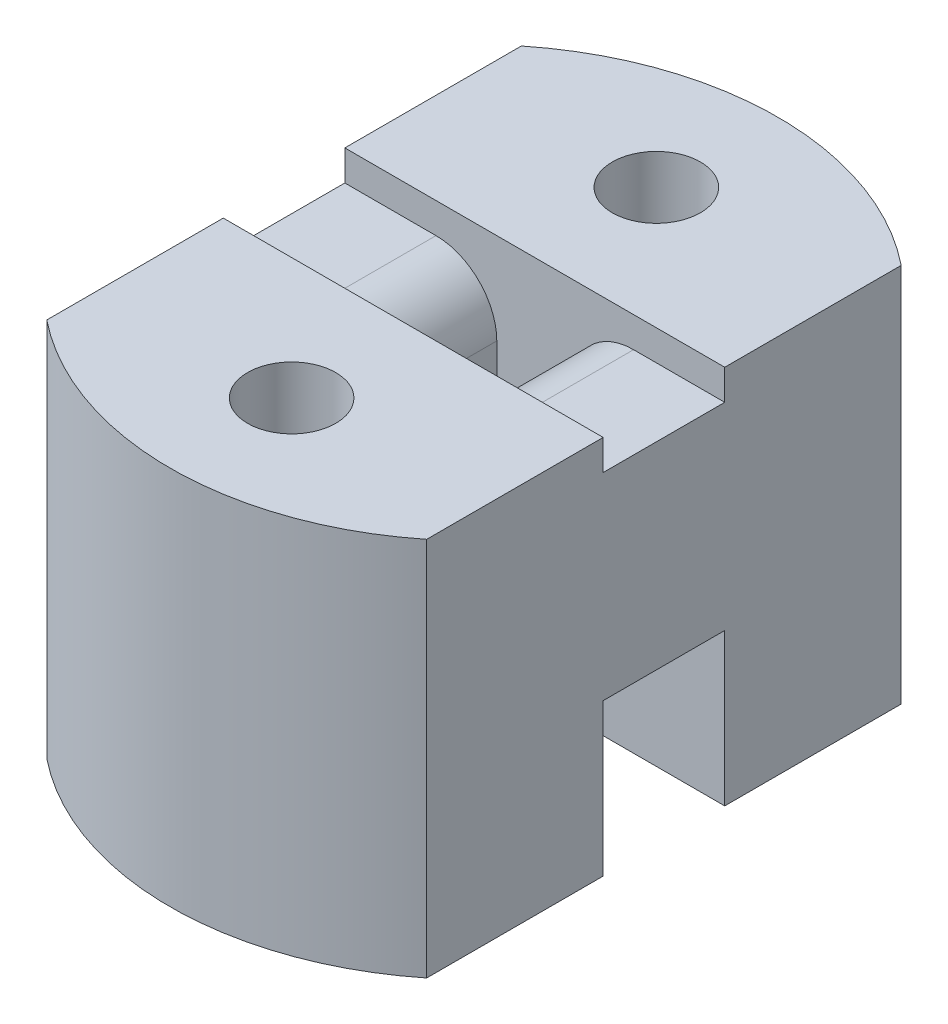
ISO-10303-21;
HEADER;
FILE_DESCRIPTION(('STEP AP214'),'2;1');
FILE_NAME('part.step','',(''),(''),'','','');
FILE_SCHEMA(('AUTOMOTIVE_DESIGN { 1 0 10303 214 1 1 1 1 }'));
ENDSEC;
DATA;
#1=APPLICATION_CONTEXT('core data for automotive mechanical design processes');
#2=APPLICATION_PROTOCOL_DEFINITION('international standard','automotive_design',2000,#1);
#3=PRODUCT_CONTEXT('',#1,'mechanical');
#4=PRODUCT('Part','Part','',(#3));
#5=PRODUCT_RELATED_PRODUCT_CATEGORY('part','',(#4));
#6=PRODUCT_DEFINITION_FORMATION('','',#4);
#7=PRODUCT_DEFINITION_CONTEXT('part definition',#1,'design');
#8=PRODUCT_DEFINITION('design','',#6,#7);
#9=PRODUCT_DEFINITION_SHAPE('','',#8);
#10=(LENGTH_UNIT() NAMED_UNIT(*) SI_UNIT(.MILLI.,.METRE.));
#11=(NAMED_UNIT(*) PLANE_ANGLE_UNIT() SI_UNIT($,.RADIAN.));
#12=(NAMED_UNIT(*) SI_UNIT($,.STERADIAN.) SOLID_ANGLE_UNIT());
#13=UNCERTAINTY_MEASURE_WITH_UNIT(LENGTH_MEASURE(1.E-05),#10,'distance_accuracy_value','');
#14=(GEOMETRIC_REPRESENTATION_CONTEXT(3) GLOBAL_UNCERTAINTY_ASSIGNED_CONTEXT((#13)) GLOBAL_UNIT_ASSIGNED_CONTEXT((#10,
#11,#12)) REPRESENTATION_CONTEXT('',''));
#15=CARTESIAN_POINT('',(0.,0.,0.));
#16=DIRECTION('',(0.,0.,1.));
#17=DIRECTION('',(1.,0.,0.));
#18=AXIS2_PLACEMENT_3D('',#15,#16,#17);
#19=CARTESIAN_POINT('',(0.,0.,0.));
#20=DIRECTION('',(0.,1.,0.));
#21=DIRECTION('',(0.,0.,1.));
#22=AXIS2_PLACEMENT_3D('',#19,#20,#21);
#23=PLANE('',#22);
#24=DIRECTION('',(-0.5,0.,0.866025403784438));
#25=VECTOR('',#24,1.);
#26=CARTESIAN_POINT('',(4.90747728811182,0.,-12.));
#27=LINE('',#26,#25);
#28=CARTESIAN_POINT('',(4.90747728811182,0.,-12.));
#29=VERTEX_POINT('',#28);
#30=CARTESIAN_POINT('',(2.45373864405591,0.,-7.75));
#31=VERTEX_POINT('',#30);
#32=EDGE_CURVE('E333',#29,#31,#27,.T.);
#33=ORIENTED_EDGE('',*,*,#32,.F.);
#34=DIRECTION('',(0.499999999999999,0.,0.866025403784439));
#35=VECTOR('',#34,1.);
#36=CARTESIAN_POINT('',(2.45373864405591,0.,-16.25));
#37=LINE('',#36,#35);
#38=CARTESIAN_POINT('',(2.45373864405591,0.,-16.25));
#39=VERTEX_POINT('',#38);
#40=EDGE_CURVE('E303',#39,#29,#37,.T.);
#41=ORIENTED_EDGE('',*,*,#40,.F.);
#42=DIRECTION('',(1.,0.,0.));
#43=VECTOR('',#42,1.);
#44=CARTESIAN_POINT('',(-2.45373864405591,0.,-16.25));
#45=LINE('',#44,#43);
#46=CARTESIAN_POINT('',(-2.45373864405591,0.,-16.25));
#47=VERTEX_POINT('',#46);
#48=EDGE_CURVE('E316',#47,#39,#45,.T.);
#49=ORIENTED_EDGE('',*,*,#48,.F.);
#50=DIRECTION('',(0.5,0.,-0.866025403784438));
#51=VECTOR('',#50,1.);
#52=CARTESIAN_POINT('',(-4.90747728811182,0.,-12.));
#53=LINE('',#52,#51);
#54=CARTESIAN_POINT('',(-4.90747728811182,0.,-12.));
#55=VERTEX_POINT('',#54);
#56=EDGE_CURVE('E342',#55,#47,#53,.T.);
#57=ORIENTED_EDGE('',*,*,#56,.F.);
#58=DIRECTION('',(-0.499999999999999,0.,-0.866025403784439));
#59=VECTOR('',#58,1.);
#60=CARTESIAN_POINT('',(-2.45373864405591,0.,-7.75));
#61=LINE('',#60,#59);
#62=CARTESIAN_POINT('',(-2.45373864405591,0.,-7.75));
#63=VERTEX_POINT('',#62);
#64=EDGE_CURVE('E339',#63,#55,#61,.T.);
#65=ORIENTED_EDGE('',*,*,#64,.F.);
#66=DIRECTION('',(-1.,0.,0.));
#67=VECTOR('',#66,1.);
#68=CARTESIAN_POINT('',(2.45373864405591,0.,-7.75));
#69=LINE('',#68,#67);
#70=EDGE_CURVE('E336',#31,#63,#69,.T.);
#71=ORIENTED_EDGE('',*,*,#70,.F.);
#72=EDGE_LOOP('',(#33,#41,#49,#57,#65,#71));
#73=FACE_BOUND('',#72,.T.);
#74=DIRECTION('',(0.,0.,1.));
#75=VECTOR('',#74,1.);
#76=CARTESIAN_POINT('',(-12.5,0.,-20.));
#77=LINE('',#76,#75);
#78=CARTESIAN_POINT('',(-12.5,0.,-15.612494995996));
#79=VERTEX_POINT('',#78);
#80=CARTESIAN_POINT('',(-12.5,0.,-4.));
#81=VERTEX_POINT('',#80);
#82=EDGE_CURVE('E543',#79,#81,#77,.T.);
#83=ORIENTED_EDGE('',*,*,#82,.F.);
#84=CARTESIAN_POINT('',(0.,0.,0.));
#85=DIRECTION('',(0.,1.,0.));
#86=DIRECTION('',(0.,0.,1.));
#87=AXIS2_PLACEMENT_3D('',#84,#85,#86);
#88=CIRCLE('',#87,20.);
#89=CARTESIAN_POINT('',(12.5,0.,-15.612494995996));
#90=VERTEX_POINT('',#89);
#91=EDGE_CURVE('E266',#90,#79,#88,.T.);
#92=ORIENTED_EDGE('',*,*,#91,.F.);
#93=DIRECTION('',(0.,0.,-1.));
#94=VECTOR('',#93,1.);
#95=CARTESIAN_POINT('',(12.5,0.,-20.));
#96=LINE('',#95,#94);
#97=CARTESIAN_POINT('',(12.5,0.,-4.));
#98=VERTEX_POINT('',#97);
#99=EDGE_CURVE('E495',#98,#90,#96,.T.);
#100=ORIENTED_EDGE('',*,*,#99,.F.);
#101=DIRECTION('',(-1.,0.,0.));
#102=VECTOR('',#101,1.);
#103=CARTESIAN_POINT('',(-2.5,0.,-4.));
#104=LINE('',#103,#102);
#105=EDGE_CURVE('E296',#98,#81,#104,.T.);
#106=ORIENTED_EDGE('',*,*,#105,.T.);
#107=EDGE_LOOP('',(#83,#92,#100,#106));
#108=FACE_BOUND('',#107,.T.);
#109=ADVANCED_FACE('F34',(#73,#108),#23,.F.);
#110=CARTESIAN_POINT('',(0.,23.,0.));
#111=DIRECTION('',(0.,1.,0.));
#112=DIRECTION('',(0.,0.,1.));
#113=AXIS2_PLACEMENT_3D('',#110,#111,#112);
#114=PLANE('',#113);
#115=DIRECTION('',(-1.,0.,0.));
#116=VECTOR('',#115,1.);
#117=CARTESIAN_POINT('',(-20.,23.,-3.99999999999999));
#118=LINE('',#117,#116);
#119=CARTESIAN_POINT('',(-6.5,23.,-4.));
#120=VERTEX_POINT('',#119);
#121=CARTESIAN_POINT('',(-12.5,23.,-4.));
#122=VERTEX_POINT('',#121);
#123=EDGE_CURVE('E418',#120,#122,#118,.T.);
#124=ORIENTED_EDGE('',*,*,#123,.T.);
#125=DIRECTION('',(0.,0.,1.));
#126=VECTOR('',#125,1.);
#127=CARTESIAN_POINT('',(-12.5,23.,0.));
#128=LINE('',#127,#126);
#129=CARTESIAN_POINT('',(-12.5,23.,4.00000000000001));
#130=VERTEX_POINT('',#129);
#131=EDGE_CURVE('E498',#122,#130,#128,.T.);
#132=ORIENTED_EDGE('',*,*,#131,.T.);
#133=DIRECTION('',(1.,0.,0.));
#134=VECTOR('',#133,1.);
#135=CARTESIAN_POINT('',(-20.,23.,4.00000000000001));
#136=LINE('',#135,#134);
#137=CARTESIAN_POINT('',(-6.5,23.,4.00000000000001));
#138=VERTEX_POINT('',#137);
#139=EDGE_CURVE('E416',#130,#138,#136,.T.);
#140=ORIENTED_EDGE('',*,*,#139,.T.);
#141=DIRECTION('',(0.,0.,1.));
#142=VECTOR('',#141,1.);
#143=CARTESIAN_POINT('',(-6.5,23.,-4.));
#144=LINE('',#143,#142);
#145=EDGE_CURVE('E447',#138,#120,#144,.F.);
#146=ORIENTED_EDGE('',*,*,#145,.T.);
#147=EDGE_LOOP('',(#124,#132,#140,#146));
#148=FACE_BOUND('',#147,.T.);
#149=ADVANCED_FACE('F503',(#148),#114,.T.);
#150=CARTESIAN_POINT('',(0.,25.,0.));
#151=DIRECTION('',(0.,1.,0.));
#152=DIRECTION('',(0.,0.,1.));
#153=AXIS2_PLACEMENT_3D('',#150,#151,#152);
#154=PLANE('',#153);
#155=CARTESIAN_POINT('',(0.,25.,-12.));
#156=DIRECTION('',(0.,1.,0.));
#157=DIRECTION('',(0.,0.,1.));
#158=AXIS2_PLACEMENT_3D('',#155,#156,#157);
#159=CIRCLE('',#158,2.9);
#160=CARTESIAN_POINT('',(0.,25.,-9.1));
#161=VERTEX_POINT('',#160);
#162=EDGE_CURVE('E409',#161,#161,#159,.T.);
#163=ORIENTED_EDGE('',*,*,#162,.F.);
#164=EDGE_LOOP('',(#163));
#165=FACE_BOUND('',#164,.T.);
#166=CARTESIAN_POINT('',(0.,25.,0.));
#167=DIRECTION('',(0.,1.,0.));
#168=DIRECTION('',(0.,0.,1.));
#169=AXIS2_PLACEMENT_3D('',#166,#167,#168);
#170=CIRCLE('',#169,20.);
#171=CARTESIAN_POINT('',(12.5,25.,-15.612494995996));
#172=VERTEX_POINT('',#171);
#173=CARTESIAN_POINT('',(-12.5,25.,-15.612494995996));
#174=VERTEX_POINT('',#173);
#175=EDGE_CURVE('E243',#172,#174,#170,.T.);
#176=ORIENTED_EDGE('',*,*,#175,.T.);
#177=DIRECTION('',(0.,0.,1.));
#178=VECTOR('',#177,1.);
#179=CARTESIAN_POINT('',(-12.5,25.,-20.));
#180=LINE('',#179,#178);
#181=CARTESIAN_POINT('',(-12.5,25.,-4.));
#182=VERTEX_POINT('',#181);
#183=EDGE_CURVE('E247',#174,#182,#180,.T.);
#184=ORIENTED_EDGE('',*,*,#183,.T.);
#185=DIRECTION('',(-1.,0.,0.));
#186=VECTOR('',#185,1.);
#187=CARTESIAN_POINT('',(0.,25.,-4.));
#188=LINE('',#187,#186);
#189=CARTESIAN_POINT('',(12.5,25.,-4.));
#190=VERTEX_POINT('',#189);
#191=EDGE_CURVE('E425',#190,#182,#188,.T.);
#192=ORIENTED_EDGE('',*,*,#191,.F.);
#193=DIRECTION('',(0.,0.,-1.));
#194=VECTOR('',#193,1.);
#195=CARTESIAN_POINT('',(12.5,25.,-20.));
#196=LINE('',#195,#194);
#197=EDGE_CURVE('E249',#190,#172,#196,.T.);
#198=ORIENTED_EDGE('',*,*,#197,.T.);
#199=EDGE_LOOP('',(#176,#184,#192,#198));
#200=FACE_BOUND('',#199,.T.);
#201=ADVANCED_FACE('F245',(#165,#200),#154,.T.);
#202=CARTESIAN_POINT('',(0.,25.,0.));
#203=DIRECTION('',(0.,-1.,0.));
#204=DIRECTION('',(0.,0.,-1.));
#205=AXIS2_PLACEMENT_3D('',#202,#203,#204);
#206=CYLINDRICAL_SURFACE('',#205,20.);
#207=ORIENTED_EDGE('',*,*,#91,.T.);
#208=DIRECTION('',(0.,-1.,0.));
#209=VECTOR('',#208,1.);
#210=CARTESIAN_POINT('',(-12.5,25.,-15.612494995996));
#211=LINE('',#210,#209);
#212=EDGE_CURVE('E258',#174,#79,#211,.T.);
#213=ORIENTED_EDGE('',*,*,#212,.F.);
#214=ORIENTED_EDGE('',*,*,#175,.F.);
#215=DIRECTION('',(0.,-1.,0.));
#216=VECTOR('',#215,1.);
#217=CARTESIAN_POINT('',(12.5,25.,-15.612494995996));
#218=LINE('',#217,#216);
#219=EDGE_CURVE('E280',#90,#172,#218,.F.);
#220=ORIENTED_EDGE('',*,*,#219,.F.);
#221=EDGE_LOOP('',(#207,#213,#214,#220));
#222=FACE_BOUND('',#221,.T.);
#223=ADVANCED_FACE('F264',(#222),#206,.T.);
#224=DIRECTION('',(0.,-1.,0.));
#225=VECTOR('',#224,1.);
#226=CARTESIAN_POINT('',(12.5,25.,15.612494995996));
#227=LINE('',#226,#225);
#228=CARTESIAN_POINT('',(12.5,25.,15.612494995996));
#229=VERTEX_POINT('',#228);
#230=CARTESIAN_POINT('',(12.5,0.,15.612494995996));
#231=VERTEX_POINT('',#230);
#232=EDGE_CURVE('E282',#229,#231,#227,.T.);
#233=ORIENTED_EDGE('',*,*,#232,.F.);
#234=CARTESIAN_POINT('',(-12.5,25.,15.612494995996));
#235=VERTEX_POINT('',#234);
#236=EDGE_CURVE('E254',#235,#229,#170,.T.);
#237=ORIENTED_EDGE('',*,*,#236,.F.);
#238=DIRECTION('',(0.,-1.,0.));
#239=VECTOR('',#238,1.);
#240=CARTESIAN_POINT('',(-12.5,25.,15.612494995996));
#241=LINE('',#240,#239);
#242=CARTESIAN_POINT('',(-12.5,0.,15.612494995996));
#243=VERTEX_POINT('',#242);
#244=EDGE_CURVE('E267',#243,#235,#241,.F.);
#245=ORIENTED_EDGE('',*,*,#244,.F.);
#246=EDGE_CURVE('E420',#243,#231,#88,.T.);
#247=ORIENTED_EDGE('',*,*,#246,.T.);
#248=EDGE_LOOP('',(#233,#237,#245,#247));
#249=FACE_BOUND('',#248,.T.);
#250=ADVANCED_FACE('F554',(#249),#206,.T.);
#251=CARTESIAN_POINT('',(0.,25.,12.));
#252=DIRECTION('',(0.,1.,0.));
#253=DIRECTION('',(0.,0.,1.));
#254=AXIS2_PLACEMENT_3D('',#251,#252,#253);
#255=CIRCLE('',#254,2.9);
#256=CARTESIAN_POINT('',(0.,25.,14.9));
#257=VERTEX_POINT('',#256);
#258=EDGE_CURVE('E412',#257,#257,#255,.T.);
#259=ORIENTED_EDGE('',*,*,#258,.F.);
#260=EDGE_LOOP('',(#259));
#261=FACE_BOUND('',#260,.T.);
#262=DIRECTION('',(1.,0.,0.));
#263=VECTOR('',#262,1.);
#264=CARTESIAN_POINT('',(0.,25.,4.00000000000001));
#265=LINE('',#264,#263);
#266=CARTESIAN_POINT('',(-12.5,25.,4.));
#267=VERTEX_POINT('',#266);
#268=CARTESIAN_POINT('',(12.5,25.,4.));
#269=VERTEX_POINT('',#268);
#270=EDGE_CURVE('E253',#267,#269,#265,.T.);
#271=ORIENTED_EDGE('',*,*,#270,.F.);
#272=EDGE_CURVE('E262',#267,#235,#180,.T.);
#273=ORIENTED_EDGE('',*,*,#272,.T.);
#274=ORIENTED_EDGE('',*,*,#236,.T.);
#275=EDGE_CURVE('E544',#229,#269,#196,.T.);
#276=ORIENTED_EDGE('',*,*,#275,.T.);
#277=EDGE_LOOP('',(#271,#273,#274,#276));
#278=FACE_BOUND('',#277,.T.);
#279=ADVANCED_FACE('F550',(#261,#278),#154,.T.);
#280=DIRECTION('',(-0.5,0.,0.866025403784439));
#281=VECTOR('',#280,1.);
#282=CARTESIAN_POINT('',(4.90747728811182,0.,12.));
#283=LINE('',#282,#281);
#284=CARTESIAN_POINT('',(4.90747728811182,0.,12.));
#285=VERTEX_POINT('',#284);
#286=CARTESIAN_POINT('',(2.45373864405591,0.,16.25));
#287=VERTEX_POINT('',#286);
#288=EDGE_CURVE('E382',#285,#287,#283,.T.);
#289=ORIENTED_EDGE('',*,*,#288,.F.);
#290=DIRECTION('',(0.499999999999999,0.,0.866025403784439));
#291=VECTOR('',#290,1.);
#292=CARTESIAN_POINT('',(2.45373864405591,0.,7.75));
#293=LINE('',#292,#291);
#294=CARTESIAN_POINT('',(2.45373864405591,0.,7.75));
#295=VERTEX_POINT('',#294);
#296=EDGE_CURVE('E380',#295,#285,#293,.T.);
#297=ORIENTED_EDGE('',*,*,#296,.F.);
#298=DIRECTION('',(1.,0.,0.));
#299=VECTOR('',#298,1.);
#300=CARTESIAN_POINT('',(-2.4537386440559,0.,7.75));
#301=LINE('',#300,#299);
#302=CARTESIAN_POINT('',(-2.4537386440559,0.,7.75));
#303=VERTEX_POINT('',#302);
#304=EDGE_CURVE('E364',#303,#295,#301,.T.);
#305=ORIENTED_EDGE('',*,*,#304,.F.);
#306=DIRECTION('',(0.5,0.,-0.866025403784438));
#307=VECTOR('',#306,1.);
#308=CARTESIAN_POINT('',(-4.90747728811182,0.,12.));
#309=LINE('',#308,#307);
#310=CARTESIAN_POINT('',(-4.90747728811182,0.,12.));
#311=VERTEX_POINT('',#310);
#312=EDGE_CURVE('E391',#311,#303,#309,.T.);
#313=ORIENTED_EDGE('',*,*,#312,.F.);
#314=DIRECTION('',(-0.5,0.,-0.866025403784439));
#315=VECTOR('',#314,1.);
#316=CARTESIAN_POINT('',(-2.45373864405591,0.,16.25));
#317=LINE('',#316,#315);
#318=CARTESIAN_POINT('',(-2.45373864405591,0.,16.25));
#319=VERTEX_POINT('',#318);
#320=EDGE_CURVE('E388',#319,#311,#317,.T.);
#321=ORIENTED_EDGE('',*,*,#320,.F.);
#322=DIRECTION('',(-1.,0.,0.));
#323=VECTOR('',#322,1.);
#324=CARTESIAN_POINT('',(2.45373864405591,0.,16.25));
#325=LINE('',#324,#323);
#326=EDGE_CURVE('E385',#287,#319,#325,.T.);
#327=ORIENTED_EDGE('',*,*,#326,.F.);
#328=EDGE_LOOP('',(#289,#297,#305,#313,#321,#327));
#329=FACE_BOUND('',#328,.T.);
#330=CARTESIAN_POINT('',(-12.5,0.,4.));
#331=VERTEX_POINT('',#330);
#332=EDGE_CURVE('E541',#331,#243,#77,.T.);
#333=ORIENTED_EDGE('',*,*,#332,.F.);
#334=DIRECTION('',(1.,0.,0.));
#335=VECTOR('',#334,1.);
#336=CARTESIAN_POINT('',(-2.5,0.,4.00000000000001));
#337=LINE('',#336,#335);
#338=CARTESIAN_POINT('',(12.5,0.,4.));
#339=VERTEX_POINT('',#338);
#340=EDGE_CURVE('E293',#331,#339,#337,.T.);
#341=ORIENTED_EDGE('',*,*,#340,.T.);
#342=EDGE_CURVE('E491',#231,#339,#96,.T.);
#343=ORIENTED_EDGE('',*,*,#342,.F.);
#344=ORIENTED_EDGE('',*,*,#246,.F.);
#345=EDGE_LOOP('',(#333,#341,#343,#344));
#346=FACE_BOUND('',#345,.T.);
#347=ADVANCED_FACE('F539',(#329,#346),#23,.F.);
#348=CARTESIAN_POINT('',(6.5,23.,4.00000000000001));
#349=VERTEX_POINT('',#348);
#350=CARTESIAN_POINT('',(12.5,23.,4.00000000000001));
#351=VERTEX_POINT('',#350);
#352=EDGE_CURVE('E415',#349,#351,#136,.T.);
#353=ORIENTED_EDGE('',*,*,#352,.T.);
#354=DIRECTION('',(0.,0.,-1.));
#355=VECTOR('',#354,1.);
#356=CARTESIAN_POINT('',(12.5,23.,0.));
#357=LINE('',#356,#355);
#358=CARTESIAN_POINT('',(12.5,23.,-4.00000000000001));
#359=VERTEX_POINT('',#358);
#360=EDGE_CURVE('E277',#351,#359,#357,.T.);
#361=ORIENTED_EDGE('',*,*,#360,.T.);
#362=CARTESIAN_POINT('',(6.5,23.,-4.));
#363=VERTEX_POINT('',#362);
#364=EDGE_CURVE('E419',#359,#363,#118,.T.);
#365=ORIENTED_EDGE('',*,*,#364,.T.);
#366=DIRECTION('',(0.,0.,-1.));
#367=VECTOR('',#366,1.);
#368=CARTESIAN_POINT('',(6.5,23.,4.00000000000001));
#369=LINE('',#368,#367);
#370=EDGE_CURVE('E449',#363,#349,#369,.F.);
#371=ORIENTED_EDGE('',*,*,#370,.T.);
#372=EDGE_LOOP('',(#353,#361,#365,#371));
#373=FACE_BOUND('',#372,.T.);
#374=ADVANCED_FACE('F517',(#373),#114,.T.);
#375=CARTESIAN_POINT('',(-20.,23.,-3.99999999999999));
#376=DIRECTION('',(0.,0.,-1.));
#377=DIRECTION('',(-1.,0.,0.));
#378=AXIS2_PLACEMENT_3D('',#375,#376,#377);
#379=PLANE('',#378);
#380=DIRECTION('',(0.,1.,0.));
#381=VECTOR('',#380,1.);
#382=CARTESIAN_POINT('',(-12.5,23.,-4.));
#383=LINE('',#382,#381);
#384=CARTESIAN_POINT('',(-12.5,10.,-4.));
#385=VERTEX_POINT('',#384);
#386=EDGE_CURVE('E56',#81,#385,#383,.T.);
#387=ORIENTED_EDGE('',*,*,#386,.F.);
#388=ORIENTED_EDGE('',*,*,#105,.F.);
#389=DIRECTION('',(0.,-1.,0.));
#390=VECTOR('',#389,1.);
#391=CARTESIAN_POINT('',(12.5,23.,-4.));
#392=LINE('',#391,#390);
#393=CARTESIAN_POINT('',(12.5,10.,-4.00000000000001));
#394=VERTEX_POINT('',#393);
#395=EDGE_CURVE('E269',#394,#98,#392,.T.);
#396=ORIENTED_EDGE('',*,*,#395,.F.);
#397=DIRECTION('',(1.,0.,0.));
#398=VECTOR('',#397,1.);
#399=CARTESIAN_POINT('',(-20.,10.,-3.99999999999999));
#400=LINE('',#399,#398);
#401=CARTESIAN_POINT('',(6.5,10.,-4.));
#402=VERTEX_POINT('',#401);
#403=EDGE_CURVE('E285',#402,#394,#400,.T.);
#404=ORIENTED_EDGE('',*,*,#403,.F.);
#405=CARTESIAN_POINT('',(6.5,14.,-4.));
#406=DIRECTION('',(0.,0.,-1.));
#407=DIRECTION('',(-1.,0.,0.));
#408=AXIS2_PLACEMENT_3D('',#405,#406,#407);
#409=CIRCLE('',#408,4.);
#410=CARTESIAN_POINT('',(2.5,14.,-4.));
#411=VERTEX_POINT('',#410);
#412=EDGE_CURVE('E456',#402,#411,#409,.T.);
#413=ORIENTED_EDGE('',*,*,#412,.T.);
#414=DIRECTION('',(0.,1.,0.));
#415=VECTOR('',#414,1.);
#416=CARTESIAN_POINT('',(2.5,0.,-4.));
#417=LINE('',#416,#415);
#418=CARTESIAN_POINT('',(2.5,19.,-4.));
#419=VERTEX_POINT('',#418);
#420=EDGE_CURVE('E304',#411,#419,#417,.T.);
#421=ORIENTED_EDGE('',*,*,#420,.T.);
#422=CARTESIAN_POINT('',(6.5,19.,-4.));
#423=DIRECTION('',(0.,0.,-1.));
#424=DIRECTION('',(-1.,0.,0.));
#425=AXIS2_PLACEMENT_3D('',#422,#423,#424);
#426=CIRCLE('',#425,4.);
#427=EDGE_CURVE('E466',#419,#363,#426,.T.);
#428=ORIENTED_EDGE('',*,*,#427,.T.);
#429=ORIENTED_EDGE('',*,*,#364,.F.);
#430=EDGE_CURVE('E276',#190,#359,#392,.T.);
#431=ORIENTED_EDGE('',*,*,#430,.F.);
#432=ORIENTED_EDGE('',*,*,#191,.T.);
#433=EDGE_CURVE('E261',#122,#182,#383,.T.);
#434=ORIENTED_EDGE('',*,*,#433,.F.);
#435=ORIENTED_EDGE('',*,*,#123,.F.);
#436=CARTESIAN_POINT('',(-6.5,19.,-4.));
#437=DIRECTION('',(0.,0.,-1.));
#438=DIRECTION('',(-1.,0.,0.));
#439=AXIS2_PLACEMENT_3D('',#436,#437,#438);
#440=CIRCLE('',#439,4.);
#441=CARTESIAN_POINT('',(-2.5,19.,-4.));
#442=VERTEX_POINT('',#441);
#443=EDGE_CURVE('E464',#120,#442,#440,.T.);
#444=ORIENTED_EDGE('',*,*,#443,.T.);
#445=DIRECTION('',(0.,1.,0.));
#446=VECTOR('',#445,1.);
#447=CARTESIAN_POINT('',(-2.5,0.,-4.));
#448=LINE('',#447,#446);
#449=CARTESIAN_POINT('',(-2.5,14.,-4.));
#450=VERTEX_POINT('',#449);
#451=EDGE_CURVE('E300',#450,#442,#448,.T.);
#452=ORIENTED_EDGE('',*,*,#451,.F.);
#453=CARTESIAN_POINT('',(-6.5,14.,-4.));
#454=DIRECTION('',(0.,0.,-1.));
#455=DIRECTION('',(-1.,0.,0.));
#456=AXIS2_PLACEMENT_3D('',#453,#454,#455);
#457=CIRCLE('',#456,4.);
#458=CARTESIAN_POINT('',(-6.5,10.,-4.));
#459=VERTEX_POINT('',#458);
#460=EDGE_CURVE('E453',#450,#459,#457,.T.);
#461=ORIENTED_EDGE('',*,*,#460,.T.);
#462=EDGE_CURVE('E288',#385,#459,#400,.T.);
#463=ORIENTED_EDGE('',*,*,#462,.F.);
#464=EDGE_LOOP('',(#387,#388,#396,#404,#413,#421,#428,#429,#431,#432,#434,#435,#444,#452,#461,#463));
#465=FACE_BOUND('',#464,.T.);
#466=ADVANCED_FACE('F476',(#465),#379,.F.);
#467=CARTESIAN_POINT('',(-20.,23.,4.00000000000001));
#468=DIRECTION('',(0.,0.,1.));
#469=DIRECTION('',(1.,0.,0.));
#470=AXIS2_PLACEMENT_3D('',#467,#468,#469);
#471=PLANE('',#470);
#472=DIRECTION('',(0.,-1.,0.));
#473=VECTOR('',#472,1.);
#474=CARTESIAN_POINT('',(-12.5,23.,4.00000000000001));
#475=LINE('',#474,#473);
#476=EDGE_CURVE('E493',#267,#130,#475,.T.);
#477=ORIENTED_EDGE('',*,*,#476,.F.);
#478=ORIENTED_EDGE('',*,*,#270,.T.);
#479=DIRECTION('',(0.,1.,0.));
#480=VECTOR('',#479,1.);
#481=CARTESIAN_POINT('',(12.5,23.,4.00000000000001));
#482=LINE('',#481,#480);
#483=EDGE_CURVE('E271',#351,#269,#482,.T.);
#484=ORIENTED_EDGE('',*,*,#483,.F.);
#485=ORIENTED_EDGE('',*,*,#352,.F.);
#486=CARTESIAN_POINT('',(6.5,19.,4.00000000000001));
#487=DIRECTION('',(0.,0.,1.));
#488=DIRECTION('',(1.,0.,0.));
#489=AXIS2_PLACEMENT_3D('',#486,#487,#488);
#490=CIRCLE('',#489,4.);
#491=CARTESIAN_POINT('',(2.5,19.,4.00000000000001));
#492=VERTEX_POINT('',#491);
#493=EDGE_CURVE('E469',#349,#492,#490,.T.);
#494=ORIENTED_EDGE('',*,*,#493,.T.);
#495=DIRECTION('',(0.,1.,0.));
#496=VECTOR('',#495,1.);
#497=CARTESIAN_POINT('',(2.5,0.,4.00000000000001));
#498=LINE('',#497,#496);
#499=CARTESIAN_POINT('',(2.5,14.,4.00000000000001));
#500=VERTEX_POINT('',#499);
#501=EDGE_CURVE('E307',#500,#492,#498,.T.);
#502=ORIENTED_EDGE('',*,*,#501,.F.);
#503=CARTESIAN_POINT('',(6.5,14.,4.00000000000001));
#504=DIRECTION('',(0.,0.,1.));
#505=DIRECTION('',(1.,0.,0.));
#506=AXIS2_PLACEMENT_3D('',#503,#504,#505);
#507=CIRCLE('',#506,4.);
#508=CARTESIAN_POINT('',(6.5,10.,4.00000000000001));
#509=VERTEX_POINT('',#508);
#510=EDGE_CURVE('E458',#500,#509,#507,.T.);
#511=ORIENTED_EDGE('',*,*,#510,.T.);
#512=DIRECTION('',(-1.,0.,0.));
#513=VECTOR('',#512,1.);
#514=CARTESIAN_POINT('',(-20.,10.,4.00000000000001));
#515=LINE('',#514,#513);
#516=CARTESIAN_POINT('',(12.5,10.,4.00000000000001));
#517=VERTEX_POINT('',#516);
#518=EDGE_CURVE('E292',#517,#509,#515,.T.);
#519=ORIENTED_EDGE('',*,*,#518,.F.);
#520=EDGE_CURVE('E49',#339,#517,#482,.T.);
#521=ORIENTED_EDGE('',*,*,#520,.F.);
#522=ORIENTED_EDGE('',*,*,#340,.F.);
#523=CARTESIAN_POINT('',(-12.5,10.,4.00000000000001));
#524=VERTEX_POINT('',#523);
#525=EDGE_CURVE('E489',#524,#331,#475,.T.);
#526=ORIENTED_EDGE('',*,*,#525,.F.);
#527=CARTESIAN_POINT('',(-6.5,10.,4.00000000000001));
#528=VERTEX_POINT('',#527);
#529=EDGE_CURVE('E289',#528,#524,#515,.T.);
#530=ORIENTED_EDGE('',*,*,#529,.F.);
#531=CARTESIAN_POINT('',(-6.5,14.,4.00000000000001));
#532=DIRECTION('',(0.,0.,1.));
#533=DIRECTION('',(1.,0.,0.));
#534=AXIS2_PLACEMENT_3D('',#531,#532,#533);
#535=CIRCLE('',#534,4.);
#536=CARTESIAN_POINT('',(-2.5,14.,4.00000000000001));
#537=VERTEX_POINT('',#536);
#538=EDGE_CURVE('E451',#528,#537,#535,.T.);
#539=ORIENTED_EDGE('',*,*,#538,.T.);
#540=DIRECTION('',(0.,1.,0.));
#541=VECTOR('',#540,1.);
#542=CARTESIAN_POINT('',(-2.5,0.,4.00000000000001));
#543=LINE('',#542,#541);
#544=CARTESIAN_POINT('',(-2.5,19.,4.00000000000001));
#545=VERTEX_POINT('',#544);
#546=EDGE_CURVE('E299',#537,#545,#543,.T.);
#547=ORIENTED_EDGE('',*,*,#546,.T.);
#548=CARTESIAN_POINT('',(-6.5,19.,4.00000000000001));
#549=DIRECTION('',(0.,0.,1.));
#550=DIRECTION('',(1.,0.,0.));
#551=AXIS2_PLACEMENT_3D('',#548,#549,#550);
#552=CIRCLE('',#551,4.);
#553=EDGE_CURVE('E461',#545,#138,#552,.T.);
#554=ORIENTED_EDGE('',*,*,#553,.T.);
#555=ORIENTED_EDGE('',*,*,#139,.F.);
#556=EDGE_LOOP('',(#477,#478,#484,#485,#494,#502,#511,#519,#521,#522,#526,#530,#539,#547,#554,#555));
#557=FACE_BOUND('',#556,.T.);
#558=ADVANCED_FACE('F486',(#557),#471,.F.);
#559=CARTESIAN_POINT('',(0.,10.,0.));
#560=DIRECTION('',(0.,-1.,0.));
#561=DIRECTION('',(0.,0.,-1.));
#562=AXIS2_PLACEMENT_3D('',#559,#560,#561);
#563=PLANE('',#562);
#564=ORIENTED_EDGE('',*,*,#403,.T.);
#565=DIRECTION('',(0.,0.,1.));
#566=VECTOR('',#565,1.);
#567=CARTESIAN_POINT('',(12.5,10.,0.));
#568=LINE('',#567,#566);
#569=EDGE_CURVE('E12',#394,#517,#568,.T.);
#570=ORIENTED_EDGE('',*,*,#569,.T.);
#571=ORIENTED_EDGE('',*,*,#518,.T.);
#572=DIRECTION('',(0.,0.,-1.));
#573=VECTOR('',#572,1.);
#574=CARTESIAN_POINT('',(6.5,10.,-4.));
#575=LINE('',#574,#573);
#576=EDGE_CURVE('E439',#509,#402,#575,.T.);
#577=ORIENTED_EDGE('',*,*,#576,.T.);
#578=EDGE_LOOP('',(#564,#570,#571,#577));
#579=FACE_BOUND('',#578,.T.);
#580=ADVANCED_FACE('F535',(#579),#563,.T.);
#581=ORIENTED_EDGE('',*,*,#529,.T.);
#582=DIRECTION('',(0.,0.,-1.));
#583=VECTOR('',#582,1.);
#584=CARTESIAN_POINT('',(-12.5,10.,0.));
#585=LINE('',#584,#583);
#586=EDGE_CURVE('E42',#524,#385,#585,.T.);
#587=ORIENTED_EDGE('',*,*,#586,.T.);
#588=ORIENTED_EDGE('',*,*,#462,.T.);
#589=DIRECTION('',(0.,0.,1.));
#590=VECTOR('',#589,1.);
#591=CARTESIAN_POINT('',(-6.5,10.,4.00000000000001));
#592=LINE('',#591,#590);
#593=EDGE_CURVE('E427',#459,#528,#592,.T.);
#594=ORIENTED_EDGE('',*,*,#593,.T.);
#595=EDGE_LOOP('',(#581,#587,#588,#594));
#596=FACE_BOUND('',#595,.T.);
#597=ADVANCED_FACE('F472',(#596),#563,.T.);
#598=CARTESIAN_POINT('',(-2.5,0.,-4.));
#599=DIRECTION('',(-1.,0.,0.));
#600=DIRECTION('',(0.,0.,1.));
#601=AXIS2_PLACEMENT_3D('',#598,#599,#600);
#602=PLANE('',#601);
#603=ORIENTED_EDGE('',*,*,#546,.F.);
#604=DIRECTION('',(0.,0.,1.));
#605=VECTOR('',#604,1.);
#606=CARTESIAN_POINT('',(-2.5,14.,-4.));
#607=LINE('',#606,#605);
#608=EDGE_CURVE('E437',#537,#450,#607,.F.);
#609=ORIENTED_EDGE('',*,*,#608,.T.);
#610=ORIENTED_EDGE('',*,*,#451,.T.);
#611=DIRECTION('',(0.,0.,1.));
#612=VECTOR('',#611,1.);
#613=CARTESIAN_POINT('',(-2.5,19.,4.00000000000001));
#614=LINE('',#613,#612);
#615=EDGE_CURVE('E434',#442,#545,#614,.T.);
#616=ORIENTED_EDGE('',*,*,#615,.T.);
#617=EDGE_LOOP('',(#603,#609,#610,#616));
#618=FACE_BOUND('',#617,.T.);
#619=ADVANCED_FACE('F648',(#618),#602,.F.);
#620=CARTESIAN_POINT('',(2.5,0.,-4.));
#621=DIRECTION('',(1.,0.,0.));
#622=DIRECTION('',(0.,0.,-1.));
#623=AXIS2_PLACEMENT_3D('',#620,#621,#622);
#624=PLANE('',#623);
#625=ORIENTED_EDGE('',*,*,#420,.F.);
#626=DIRECTION('',(0.,0.,-1.));
#627=VECTOR('',#626,1.);
#628=CARTESIAN_POINT('',(2.5,14.,4.00000000000001));
#629=LINE('',#628,#627);
#630=EDGE_CURVE('E445',#411,#500,#629,.F.);
#631=ORIENTED_EDGE('',*,*,#630,.T.);
#632=ORIENTED_EDGE('',*,*,#501,.T.);
#633=DIRECTION('',(0.,0.,-1.));
#634=VECTOR('',#633,1.);
#635=CARTESIAN_POINT('',(2.5,19.,-4.));
#636=LINE('',#635,#634);
#637=EDGE_CURVE('E442',#492,#419,#636,.T.);
#638=ORIENTED_EDGE('',*,*,#637,.T.);
#639=EDGE_LOOP('',(#625,#631,#632,#638));
#640=FACE_BOUND('',#639,.T.);
#641=ADVANCED_FACE('F526',(#640),#624,.F.);
#642=CARTESIAN_POINT('',(0.,25.,-12.));
#643=DIRECTION('',(0.,1.,0.));
#644=DIRECTION('',(0.,0.,1.));
#645=AXIS2_PLACEMENT_3D('',#642,#643,#644);
#646=CYLINDRICAL_SURFACE('',#645,2.9);
#647=ORIENTED_EDGE('',*,*,#162,.T.);
#648=EDGE_LOOP('',(#647));
#649=FACE_BOUND('',#648,.T.);
#650=CARTESIAN_POINT('',(0.,6.,-12.));
#651=DIRECTION('',(0.,-1.,0.));
#652=DIRECTION('',(0.,0.,-1.));
#653=AXIS2_PLACEMENT_3D('',#650,#651,#652);
#654=CIRCLE('',#653,2.9);
#655=CARTESIAN_POINT('',(0.,6.,-14.9));
#656=VERTEX_POINT('',#655);
#657=EDGE_CURVE('E349',#656,#656,#654,.F.);
#658=ORIENTED_EDGE('',*,*,#657,.F.);
#659=EDGE_LOOP('',(#658));
#660=FACE_BOUND('',#659,.T.);
#661=ADVANCED_FACE('F612',(#649,#660),#646,.F.);
#662=CARTESIAN_POINT('',(0.,25.,12.));
#663=DIRECTION('',(0.,1.,0.));
#664=DIRECTION('',(0.,0.,1.));
#665=AXIS2_PLACEMENT_3D('',#662,#663,#664);
#666=CYLINDRICAL_SURFACE('',#665,2.9);
#667=ORIENTED_EDGE('',*,*,#258,.T.);
#668=EDGE_LOOP('',(#667));
#669=FACE_BOUND('',#668,.T.);
#670=CARTESIAN_POINT('',(0.,6.,12.));
#671=DIRECTION('',(0.,-1.,0.));
#672=DIRECTION('',(0.,0.,-1.));
#673=AXIS2_PLACEMENT_3D('',#670,#671,#672);
#674=CIRCLE('',#673,2.9);
#675=CARTESIAN_POINT('',(0.,6.,9.1));
#676=VERTEX_POINT('',#675);
#677=EDGE_CURVE('E398',#676,#676,#674,.F.);
#678=ORIENTED_EDGE('',*,*,#677,.F.);
#679=EDGE_LOOP('',(#678));
#680=FACE_BOUND('',#679,.T.);
#681=ADVANCED_FACE('F607',(#669,#680),#666,.F.);
#682=CARTESIAN_POINT('',(0.,6.,0.));
#683=DIRECTION('',(0.,-1.,0.));
#684=DIRECTION('',(0.,0.,-1.));
#685=AXIS2_PLACEMENT_3D('',#682,#683,#684);
#686=PLANE('',#685);
#687=DIRECTION('',(0.499999999999999,0.,0.866025403784439));
#688=VECTOR('',#687,1.);
#689=CARTESIAN_POINT('',(2.45373864405591,6.,7.75));
#690=LINE('',#689,#688);
#691=CARTESIAN_POINT('',(2.45373864405591,6.,7.75));
#692=VERTEX_POINT('',#691);
#693=CARTESIAN_POINT('',(4.90747728811182,6.,12.));
#694=VERTEX_POINT('',#693);
#695=EDGE_CURVE('E360',#692,#694,#690,.T.);
#696=ORIENTED_EDGE('',*,*,#695,.T.);
#697=DIRECTION('',(-0.5,0.,0.866025403784439));
#698=VECTOR('',#697,1.);
#699=CARTESIAN_POINT('',(4.90747728811182,6.,12.));
#700=LINE('',#699,#698);
#701=CARTESIAN_POINT('',(2.45373864405591,6.,16.25));
#702=VERTEX_POINT('',#701);
#703=EDGE_CURVE('E363',#694,#702,#700,.T.);
#704=ORIENTED_EDGE('',*,*,#703,.T.);
#705=DIRECTION('',(-1.,0.,0.));
#706=VECTOR('',#705,1.);
#707=CARTESIAN_POINT('',(2.45373864405591,6.,16.25));
#708=LINE('',#707,#706);
#709=CARTESIAN_POINT('',(-2.45373864405591,6.,16.25));
#710=VERTEX_POINT('',#709);
#711=EDGE_CURVE('E367',#702,#710,#708,.T.);
#712=ORIENTED_EDGE('',*,*,#711,.T.);
#713=DIRECTION('',(-0.5,0.,-0.866025403784439));
#714=VECTOR('',#713,1.);
#715=CARTESIAN_POINT('',(-2.45373864405591,6.,16.25));
#716=LINE('',#715,#714);
#717=CARTESIAN_POINT('',(-4.90747728811182,6.,12.));
#718=VERTEX_POINT('',#717);
#719=EDGE_CURVE('E370',#710,#718,#716,.T.);
#720=ORIENTED_EDGE('',*,*,#719,.T.);
#721=DIRECTION('',(0.5,0.,-0.866025403784438));
#722=VECTOR('',#721,1.);
#723=CARTESIAN_POINT('',(-4.90747728811182,6.,12.));
#724=LINE('',#723,#722);
#725=CARTESIAN_POINT('',(-2.4537386440559,6.,7.75));
#726=VERTEX_POINT('',#725);
#727=EDGE_CURVE('E373',#718,#726,#724,.T.);
#728=ORIENTED_EDGE('',*,*,#727,.T.);
#729=DIRECTION('',(1.,0.,0.));
#730=VECTOR('',#729,1.);
#731=CARTESIAN_POINT('',(-2.4537386440559,6.,7.75));
#732=LINE('',#731,#730);
#733=EDGE_CURVE('E376',#726,#692,#732,.T.);
#734=ORIENTED_EDGE('',*,*,#733,.T.);
#735=EDGE_LOOP('',(#696,#704,#712,#720,#728,#734));
#736=FACE_BOUND('',#735,.T.);
#737=ORIENTED_EDGE('',*,*,#677,.T.);
#738=EDGE_LOOP('',(#737));
#739=FACE_BOUND('',#738,.T.);
#740=ADVANCED_FACE('F604',(#736,#739),#686,.T.);
#741=CARTESIAN_POINT('',(2.45373864405591,6.,7.75));
#742=DIRECTION('',(0.866025403784439,0.,-0.499999999999999));
#743=DIRECTION('',(-0.499999999999999,0.,-0.866025403784439));
#744=AXIS2_PLACEMENT_3D('',#741,#742,#743);
#745=PLANE('',#744);
#746=ORIENTED_EDGE('',*,*,#296,.T.);
#747=DIRECTION('',(0.,-1.,0.));
#748=VECTOR('',#747,1.);
#749=CARTESIAN_POINT('',(4.90747728811182,6.,12.));
#750=LINE('',#749,#748);
#751=EDGE_CURVE('E379',#694,#285,#750,.T.);
#752=ORIENTED_EDGE('',*,*,#751,.F.);
#753=ORIENTED_EDGE('',*,*,#695,.F.);
#754=DIRECTION('',(0.,-1.,0.));
#755=VECTOR('',#754,1.);
#756=CARTESIAN_POINT('',(2.45373864405591,6.,7.75));
#757=LINE('',#756,#755);
#758=EDGE_CURVE('E396',#692,#295,#757,.T.);
#759=ORIENTED_EDGE('',*,*,#758,.T.);
#760=EDGE_LOOP('',(#746,#752,#753,#759));
#761=FACE_BOUND('',#760,.T.);
#762=ADVANCED_FACE('F590',(#761),#745,.F.);
#763=CARTESIAN_POINT('',(-2.4537386440559,6.,7.75));
#764=DIRECTION('',(0.,0.,-1.));
#765=DIRECTION('',(-1.,0.,0.));
#766=AXIS2_PLACEMENT_3D('',#763,#764,#765);
#767=PLANE('',#766);
#768=ORIENTED_EDGE('',*,*,#304,.T.);
#769=ORIENTED_EDGE('',*,*,#758,.F.);
#770=ORIENTED_EDGE('',*,*,#733,.F.);
#771=DIRECTION('',(0.,-1.,0.));
#772=VECTOR('',#771,1.);
#773=CARTESIAN_POINT('',(-2.4537386440559,6.,7.75));
#774=LINE('',#773,#772);
#775=EDGE_CURVE('E399',#726,#303,#774,.T.);
#776=ORIENTED_EDGE('',*,*,#775,.T.);
#777=EDGE_LOOP('',(#768,#769,#770,#776));
#778=FACE_BOUND('',#777,.T.);
#779=ADVANCED_FACE('F593',(#778),#767,.F.);
#780=CARTESIAN_POINT('',(-4.90747728811182,6.,12.));
#781=DIRECTION('',(-0.866025403784438,0.,-0.5));
#782=DIRECTION('',(-0.5,0.,0.866025403784438));
#783=AXIS2_PLACEMENT_3D('',#780,#781,#782);
#784=PLANE('',#783);
#785=ORIENTED_EDGE('',*,*,#312,.T.);
#786=ORIENTED_EDGE('',*,*,#775,.F.);
#787=ORIENTED_EDGE('',*,*,#727,.F.);
#788=DIRECTION('',(0.,-1.,0.));
#789=VECTOR('',#788,1.);
#790=CARTESIAN_POINT('',(-4.90747728811182,6.,12.));
#791=LINE('',#790,#789);
#792=EDGE_CURVE('E401',#718,#311,#791,.T.);
#793=ORIENTED_EDGE('',*,*,#792,.T.);
#794=EDGE_LOOP('',(#785,#786,#787,#793));
#795=FACE_BOUND('',#794,.T.);
#796=ADVANCED_FACE('F596',(#795),#784,.F.);
#797=CARTESIAN_POINT('',(-2.45373864405591,6.,16.25));
#798=DIRECTION('',(-0.866025403784439,0.,0.5));
#799=DIRECTION('',(0.5,0.,0.866025403784439));
#800=AXIS2_PLACEMENT_3D('',#797,#798,#799);
#801=PLANE('',#800);
#802=ORIENTED_EDGE('',*,*,#320,.T.);
#803=ORIENTED_EDGE('',*,*,#792,.F.);
#804=ORIENTED_EDGE('',*,*,#719,.F.);
#805=DIRECTION('',(0.,-1.,0.));
#806=VECTOR('',#805,1.);
#807=CARTESIAN_POINT('',(-2.45373864405591,6.,16.25));
#808=LINE('',#807,#806);
#809=EDGE_CURVE('E403',#710,#319,#808,.T.);
#810=ORIENTED_EDGE('',*,*,#809,.T.);
#811=EDGE_LOOP('',(#802,#803,#804,#810));
#812=FACE_BOUND('',#811,.T.);
#813=ADVANCED_FACE('F600',(#812),#801,.F.);
#814=CARTESIAN_POINT('',(2.45373864405591,6.,16.25));
#815=DIRECTION('',(0.,0.,1.));
#816=DIRECTION('',(1.,0.,0.));
#817=AXIS2_PLACEMENT_3D('',#814,#815,#816);
#818=PLANE('',#817);
#819=ORIENTED_EDGE('',*,*,#326,.T.);
#820=ORIENTED_EDGE('',*,*,#809,.F.);
#821=ORIENTED_EDGE('',*,*,#711,.F.);
#822=DIRECTION('',(0.,-1.,0.));
#823=VECTOR('',#822,1.);
#824=CARTESIAN_POINT('',(2.45373864405591,6.,16.25));
#825=LINE('',#824,#823);
#826=EDGE_CURVE('E405',#702,#287,#825,.T.);
#827=ORIENTED_EDGE('',*,*,#826,.T.);
#828=EDGE_LOOP('',(#819,#820,#821,#827));
#829=FACE_BOUND('',#828,.T.);
#830=ADVANCED_FACE('F602',(#829),#818,.F.);
#831=CARTESIAN_POINT('',(4.90747728811182,6.,12.));
#832=DIRECTION('',(0.866025403784439,0.,0.5));
#833=DIRECTION('',(0.5,0.,-0.866025403784439));
#834=AXIS2_PLACEMENT_3D('',#831,#832,#833);
#835=PLANE('',#834);
#836=ORIENTED_EDGE('',*,*,#288,.T.);
#837=ORIENTED_EDGE('',*,*,#826,.F.);
#838=ORIENTED_EDGE('',*,*,#703,.F.);
#839=ORIENTED_EDGE('',*,*,#751,.T.);
#840=EDGE_LOOP('',(#836,#837,#838,#839));
#841=FACE_BOUND('',#840,.T.);
#842=ADVANCED_FACE('F585',(#841),#835,.F.);
#843=CARTESIAN_POINT('',(0.,6.,0.));
#844=DIRECTION('',(0.,-1.,0.));
#845=DIRECTION('',(0.,0.,-1.));
#846=AXIS2_PLACEMENT_3D('',#843,#844,#845);
#847=PLANE('',#846);
#848=DIRECTION('',(0.499999999999999,0.,0.866025403784439));
#849=VECTOR('',#848,1.);
#850=CARTESIAN_POINT('',(2.45373864405591,6.,-16.25));
#851=LINE('',#850,#849);
#852=CARTESIAN_POINT('',(2.45373864405591,6.,-16.25));
#853=VERTEX_POINT('',#852);
#854=CARTESIAN_POINT('',(4.90747728811182,6.,-12.));
#855=VERTEX_POINT('',#854);
#856=EDGE_CURVE('E312',#853,#855,#851,.T.);
#857=ORIENTED_EDGE('',*,*,#856,.T.);
#858=DIRECTION('',(-0.5,0.,0.866025403784438));
#859=VECTOR('',#858,1.);
#860=CARTESIAN_POINT('',(4.90747728811182,6.,-12.));
#861=LINE('',#860,#859);
#862=CARTESIAN_POINT('',(2.45373864405591,6.,-7.75));
#863=VERTEX_POINT('',#862);
#864=EDGE_CURVE('E315',#855,#863,#861,.T.);
#865=ORIENTED_EDGE('',*,*,#864,.T.);
#866=DIRECTION('',(-1.,0.,0.));
#867=VECTOR('',#866,1.);
#868=CARTESIAN_POINT('',(2.45373864405591,6.,-7.75));
#869=LINE('',#868,#867);
#870=CARTESIAN_POINT('',(-2.45373864405591,6.,-7.75));
#871=VERTEX_POINT('',#870);
#872=EDGE_CURVE('E319',#863,#871,#869,.T.);
#873=ORIENTED_EDGE('',*,*,#872,.T.);
#874=DIRECTION('',(-0.499999999999999,0.,-0.866025403784439));
#875=VECTOR('',#874,1.);
#876=CARTESIAN_POINT('',(-2.45373864405591,6.,-7.75));
#877=LINE('',#876,#875);
#878=CARTESIAN_POINT('',(-4.90747728811182,6.,-12.));
#879=VERTEX_POINT('',#878);
#880=EDGE_CURVE('E322',#871,#879,#877,.T.);
#881=ORIENTED_EDGE('',*,*,#880,.T.);
#882=DIRECTION('',(0.5,0.,-0.866025403784438));
#883=VECTOR('',#882,1.);
#884=CARTESIAN_POINT('',(-4.90747728811182,6.,-12.));
#885=LINE('',#884,#883);
#886=CARTESIAN_POINT('',(-2.45373864405591,6.,-16.25));
#887=VERTEX_POINT('',#886);
#888=EDGE_CURVE('E325',#879,#887,#885,.T.);
#889=ORIENTED_EDGE('',*,*,#888,.T.);
#890=DIRECTION('',(1.,0.,0.));
#891=VECTOR('',#890,1.);
#892=CARTESIAN_POINT('',(-2.45373864405591,6.,-16.25));
#893=LINE('',#892,#891);
#894=EDGE_CURVE('E328',#887,#853,#893,.T.);
#895=ORIENTED_EDGE('',*,*,#894,.T.);
#896=EDGE_LOOP('',(#857,#865,#873,#881,#889,#895));
#897=FACE_BOUND('',#896,.T.);
#898=ORIENTED_EDGE('',*,*,#657,.T.);
#899=EDGE_LOOP('',(#898));
#900=FACE_BOUND('',#899,.T.);
#901=ADVANCED_FACE('F633',(#897,#900),#847,.T.);
#902=CARTESIAN_POINT('',(2.45373864405591,6.,-16.25));
#903=DIRECTION('',(0.866025403784439,0.,-0.499999999999999));
#904=DIRECTION('',(-0.499999999999999,0.,-0.866025403784439));
#905=AXIS2_PLACEMENT_3D('',#902,#903,#904);
#906=PLANE('',#905);
#907=ORIENTED_EDGE('',*,*,#40,.T.);
#908=DIRECTION('',(0.,-1.,0.));
#909=VECTOR('',#908,1.);
#910=CARTESIAN_POINT('',(4.90747728811182,6.,-12.));
#911=LINE('',#910,#909);
#912=EDGE_CURVE('E331',#855,#29,#911,.T.);
#913=ORIENTED_EDGE('',*,*,#912,.F.);
#914=ORIENTED_EDGE('',*,*,#856,.F.);
#915=DIRECTION('',(0.,-1.,0.));
#916=VECTOR('',#915,1.);
#917=CARTESIAN_POINT('',(2.45373864405591,6.,-16.25));
#918=LINE('',#917,#916);
#919=EDGE_CURVE('E347',#853,#39,#918,.T.);
#920=ORIENTED_EDGE('',*,*,#919,.T.);
#921=EDGE_LOOP('',(#907,#913,#914,#920));
#922=FACE_BOUND('',#921,.T.);
#923=ADVANCED_FACE('F635',(#922),#906,.F.);
#924=CARTESIAN_POINT('',(-2.45373864405591,6.,-16.25));
#925=DIRECTION('',(0.,0.,-1.));
#926=DIRECTION('',(-1.,0.,0.));
#927=AXIS2_PLACEMENT_3D('',#924,#925,#926);
#928=PLANE('',#927);
#929=ORIENTED_EDGE('',*,*,#48,.T.);
#930=ORIENTED_EDGE('',*,*,#919,.F.);
#931=ORIENTED_EDGE('',*,*,#894,.F.);
#932=DIRECTION('',(0.,-1.,0.));
#933=VECTOR('',#932,1.);
#934=CARTESIAN_POINT('',(-2.45373864405591,6.,-16.25));
#935=LINE('',#934,#933);
#936=EDGE_CURVE('E350',#887,#47,#935,.T.);
#937=ORIENTED_EDGE('',*,*,#936,.T.);
#938=EDGE_LOOP('',(#929,#930,#931,#937));
#939=FACE_BOUND('',#938,.T.);
#940=ADVANCED_FACE('F642',(#939),#928,.F.);
#941=CARTESIAN_POINT('',(-4.90747728811182,6.,-12.));
#942=DIRECTION('',(-0.866025403784439,0.,-0.5));
#943=DIRECTION('',(-0.5,0.,0.866025403784439));
#944=AXIS2_PLACEMENT_3D('',#941,#942,#943);
#945=PLANE('',#944);
#946=ORIENTED_EDGE('',*,*,#56,.T.);
#947=ORIENTED_EDGE('',*,*,#936,.F.);
#948=ORIENTED_EDGE('',*,*,#888,.F.);
#949=DIRECTION('',(0.,-1.,0.));
#950=VECTOR('',#949,1.);
#951=CARTESIAN_POINT('',(-4.90747728811182,6.,-12.));
#952=LINE('',#951,#950);
#953=EDGE_CURVE('E352',#879,#55,#952,.T.);
#954=ORIENTED_EDGE('',*,*,#953,.T.);
#955=EDGE_LOOP('',(#946,#947,#948,#954));
#956=FACE_BOUND('',#955,.T.);
#957=ADVANCED_FACE('F652',(#956),#945,.F.);
#958=CARTESIAN_POINT('',(-2.45373864405591,6.,-7.75));
#959=DIRECTION('',(-0.866025403784439,0.,0.499999999999999));
#960=DIRECTION('',(0.499999999999999,0.,0.866025403784439));
#961=AXIS2_PLACEMENT_3D('',#958,#959,#960);
#962=PLANE('',#961);
#963=ORIENTED_EDGE('',*,*,#64,.T.);
#964=ORIENTED_EDGE('',*,*,#953,.F.);
#965=ORIENTED_EDGE('',*,*,#880,.F.);
#966=DIRECTION('',(0.,-1.,0.));
#967=VECTOR('',#966,1.);
#968=CARTESIAN_POINT('',(-2.45373864405591,6.,-7.75));
#969=LINE('',#968,#967);
#970=EDGE_CURVE('E354',#871,#63,#969,.T.);
#971=ORIENTED_EDGE('',*,*,#970,.T.);
#972=EDGE_LOOP('',(#963,#964,#965,#971));
#973=FACE_BOUND('',#972,.T.);
#974=ADVANCED_FACE('F656',(#973),#962,.F.);
#975=CARTESIAN_POINT('',(2.45373864405591,6.,-7.75));
#976=DIRECTION('',(0.,0.,1.));
#977=DIRECTION('',(1.,0.,0.));
#978=AXIS2_PLACEMENT_3D('',#975,#976,#977);
#979=PLANE('',#978);
#980=ORIENTED_EDGE('',*,*,#70,.T.);
#981=ORIENTED_EDGE('',*,*,#970,.F.);
#982=ORIENTED_EDGE('',*,*,#872,.F.);
#983=DIRECTION('',(0.,-1.,0.));
#984=VECTOR('',#983,1.);
#985=CARTESIAN_POINT('',(2.45373864405591,6.,-7.75));
#986=LINE('',#985,#984);
#987=EDGE_CURVE('E356',#863,#31,#986,.T.);
#988=ORIENTED_EDGE('',*,*,#987,.T.);
#989=EDGE_LOOP('',(#980,#981,#982,#988));
#990=FACE_BOUND('',#989,.T.);
#991=ADVANCED_FACE('F660',(#990),#979,.F.);
#992=CARTESIAN_POINT('',(4.90747728811182,6.,-12.));
#993=DIRECTION('',(0.866025403784438,0.,0.5));
#994=DIRECTION('',(0.5,0.,-0.866025403784439));
#995=AXIS2_PLACEMENT_3D('',#992,#993,#994);
#996=PLANE('',#995);
#997=ORIENTED_EDGE('',*,*,#32,.T.);
#998=ORIENTED_EDGE('',*,*,#987,.F.);
#999=ORIENTED_EDGE('',*,*,#864,.F.);
#1000=ORIENTED_EDGE('',*,*,#912,.T.);
#1001=EDGE_LOOP('',(#997,#998,#999,#1000));
#1002=FACE_BOUND('',#1001,.T.);
#1003=ADVANCED_FACE('F664',(#1002),#996,.F.);
#1004=CARTESIAN_POINT('',(-6.5,14.,0.));
#1005=DIRECTION('',(0.,0.,-1.));
#1006=DIRECTION('',(-1.,0.,0.));
#1007=AXIS2_PLACEMENT_3D('',#1004,#1005,#1006);
#1008=CYLINDRICAL_SURFACE('',#1007,4.);
#1009=ORIENTED_EDGE('',*,*,#460,.F.);
#1010=ORIENTED_EDGE('',*,*,#608,.F.);
#1011=ORIENTED_EDGE('',*,*,#538,.F.);
#1012=ORIENTED_EDGE('',*,*,#593,.F.);
#1013=EDGE_LOOP('',(#1009,#1010,#1011,#1012));
#1014=FACE_BOUND('',#1013,.T.);
#1015=ADVANCED_FACE('F483',(#1014),#1008,.T.);
#1016=CARTESIAN_POINT('',(6.5,14.,0.));
#1017=DIRECTION('',(0.,0.,1.));
#1018=DIRECTION('',(1.,0.,0.));
#1019=AXIS2_PLACEMENT_3D('',#1016,#1017,#1018);
#1020=CYLINDRICAL_SURFACE('',#1019,4.);
#1021=ORIENTED_EDGE('',*,*,#510,.F.);
#1022=ORIENTED_EDGE('',*,*,#630,.F.);
#1023=ORIENTED_EDGE('',*,*,#412,.F.);
#1024=ORIENTED_EDGE('',*,*,#576,.F.);
#1025=EDGE_LOOP('',(#1021,#1022,#1023,#1024));
#1026=FACE_BOUND('',#1025,.T.);
#1027=ADVANCED_FACE('F533',(#1026),#1020,.T.);
#1028=CARTESIAN_POINT('',(-6.5,19.,-4.));
#1029=DIRECTION('',(0.,0.,-1.));
#1030=DIRECTION('',(-1.,0.,0.));
#1031=AXIS2_PLACEMENT_3D('',#1028,#1029,#1030);
#1032=CYLINDRICAL_SURFACE('',#1031,4.);
#1033=ORIENTED_EDGE('',*,*,#443,.F.);
#1034=ORIENTED_EDGE('',*,*,#145,.F.);
#1035=ORIENTED_EDGE('',*,*,#553,.F.);
#1036=ORIENTED_EDGE('',*,*,#615,.F.);
#1037=EDGE_LOOP('',(#1033,#1034,#1035,#1036));
#1038=FACE_BOUND('',#1037,.T.);
#1039=ADVANCED_FACE('F510',(#1038),#1032,.T.);
#1040=CARTESIAN_POINT('',(6.5,19.,-4.));
#1041=DIRECTION('',(0.,0.,1.));
#1042=DIRECTION('',(1.,0.,0.));
#1043=AXIS2_PLACEMENT_3D('',#1040,#1041,#1042);
#1044=CYLINDRICAL_SURFACE('',#1043,4.);
#1045=ORIENTED_EDGE('',*,*,#493,.F.);
#1046=ORIENTED_EDGE('',*,*,#370,.F.);
#1047=ORIENTED_EDGE('',*,*,#427,.F.);
#1048=ORIENTED_EDGE('',*,*,#637,.F.);
#1049=EDGE_LOOP('',(#1045,#1046,#1047,#1048));
#1050=FACE_BOUND('',#1049,.T.);
#1051=ADVANCED_FACE('F36',(#1050),#1044,.T.);
#1052=CARTESIAN_POINT('',(-12.5,0.,-20.));
#1053=DIRECTION('',(-1.,0.,0.));
#1054=DIRECTION('',(0.,0.,1.));
#1055=AXIS2_PLACEMENT_3D('',#1052,#1053,#1054);
#1056=PLANE('',#1055);
#1057=ORIENTED_EDGE('',*,*,#212,.T.);
#1058=ORIENTED_EDGE('',*,*,#82,.T.);
#1059=ORIENTED_EDGE('',*,*,#386,.T.);
#1060=ORIENTED_EDGE('',*,*,#586,.F.);
#1061=ORIENTED_EDGE('',*,*,#525,.T.);
#1062=ORIENTED_EDGE('',*,*,#332,.T.);
#1063=ORIENTED_EDGE('',*,*,#244,.T.);
#1064=ORIENTED_EDGE('',*,*,#272,.F.);
#1065=ORIENTED_EDGE('',*,*,#476,.T.);
#1066=ORIENTED_EDGE('',*,*,#131,.F.);
#1067=ORIENTED_EDGE('',*,*,#433,.T.);
#1068=ORIENTED_EDGE('',*,*,#183,.F.);
#1069=EDGE_LOOP('',(#1057,#1058,#1059,#1060,#1061,#1062,#1063,#1064,#1065,#1066,#1067,#1068));
#1070=FACE_BOUND('',#1069,.T.);
#1071=ADVANCED_FACE('F257',(#1070),#1056,.T.);
#1072=CARTESIAN_POINT('',(12.5,0.,-20.));
#1073=DIRECTION('',(1.,0.,0.));
#1074=DIRECTION('',(0.,0.,-1.));
#1075=AXIS2_PLACEMENT_3D('',#1072,#1073,#1074);
#1076=PLANE('',#1075);
#1077=ORIENTED_EDGE('',*,*,#232,.T.);
#1078=ORIENTED_EDGE('',*,*,#342,.T.);
#1079=ORIENTED_EDGE('',*,*,#520,.T.);
#1080=ORIENTED_EDGE('',*,*,#569,.F.);
#1081=ORIENTED_EDGE('',*,*,#395,.T.);
#1082=ORIENTED_EDGE('',*,*,#99,.T.);
#1083=ORIENTED_EDGE('',*,*,#219,.T.);
#1084=ORIENTED_EDGE('',*,*,#197,.F.);
#1085=ORIENTED_EDGE('',*,*,#430,.T.);
#1086=ORIENTED_EDGE('',*,*,#360,.F.);
#1087=ORIENTED_EDGE('',*,*,#483,.T.);
#1088=ORIENTED_EDGE('',*,*,#275,.F.);
#1089=EDGE_LOOP('',(#1077,#1078,#1079,#1080,#1081,#1082,#1083,#1084,#1085,#1086,#1087,#1088));
#1090=FACE_BOUND('',#1089,.T.);
#1091=ADVANCED_FACE('F513',(#1090),#1076,.T.);
#1092=CLOSED_SHELL('',(#109,#149,#201,#223,#250,#279,#347,#374,#466,#558,#580,#597,#619,#641,
#661,#681,#740,#762,#779,#796,#813,#830,#842,#901,#923,#940,#957,#974,#991,#1003,#1015,#1027,
#1039,#1051,#1071,#1091));
#1093=MANIFOLD_SOLID_BREP('B2',#1092);
#1094=ADVANCED_BREP_SHAPE_REPRESENTATION('',(#18,#1093),#14);
#1095=SHAPE_DEFINITION_REPRESENTATION(#9,#1094);
ENDSEC;
END-ISO-10303-21;
